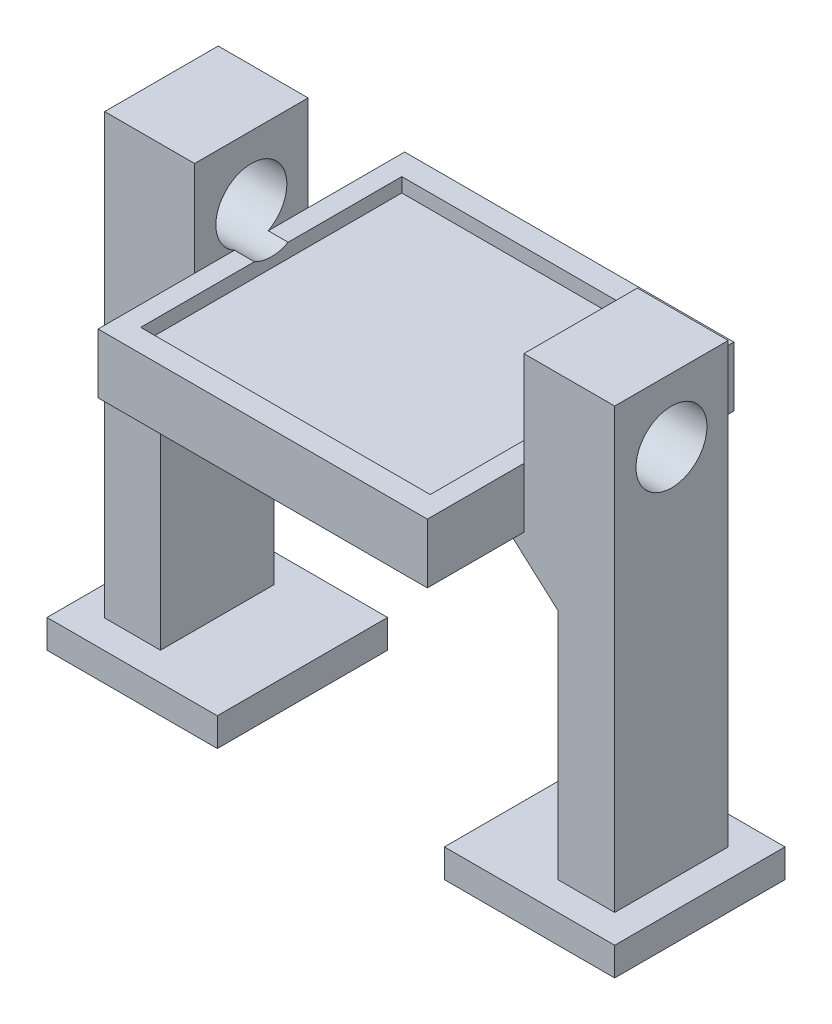
ISO-10303-21;
HEADER;
FILE_DESCRIPTION(('STEP AP214'),'2;1');
FILE_NAME('part.step','',(''),(''),'','','');
FILE_SCHEMA(('AUTOMOTIVE_DESIGN { 1 0 10303 214 1 1 1 1 }'));
ENDSEC;
DATA;
#1=APPLICATION_CONTEXT('core data for automotive mechanical design processes');
#2=APPLICATION_PROTOCOL_DEFINITION('international standard','automotive_design',2000,#1);
#3=PRODUCT_CONTEXT('',#1,'mechanical');
#4=PRODUCT('Part','Part','',(#3));
#5=PRODUCT_RELATED_PRODUCT_CATEGORY('part','',(#4));
#6=PRODUCT_DEFINITION_FORMATION('','',#4);
#7=PRODUCT_DEFINITION_CONTEXT('part definition',#1,'design');
#8=PRODUCT_DEFINITION('design','',#6,#7);
#9=PRODUCT_DEFINITION_SHAPE('','',#8);
#10=(LENGTH_UNIT() NAMED_UNIT(*) SI_UNIT(.MILLI.,.METRE.));
#11=(NAMED_UNIT(*) PLANE_ANGLE_UNIT() SI_UNIT($,.RADIAN.));
#12=(NAMED_UNIT(*) SI_UNIT($,.STERADIAN.) SOLID_ANGLE_UNIT());
#13=UNCERTAINTY_MEASURE_WITH_UNIT(LENGTH_MEASURE(1.E-05),#10,'distance_accuracy_value','');
#14=(GEOMETRIC_REPRESENTATION_CONTEXT(3) GLOBAL_UNCERTAINTY_ASSIGNED_CONTEXT((#13)) GLOBAL_UNIT_ASSIGNED_CONTEXT((#10,
#11,#12)) REPRESENTATION_CONTEXT('',''));
#15=CARTESIAN_POINT('',(0.,0.,0.));
#16=DIRECTION('',(0.,0.,1.));
#17=DIRECTION('',(1.,0.,0.));
#18=AXIS2_PLACEMENT_3D('',#15,#16,#17);
#19=CARTESIAN_POINT('',(0.,2.667,0.));
#20=DIRECTION('',(0.,1.,0.));
#21=DIRECTION('',(0.,0.,1.));
#22=AXIS2_PLACEMENT_3D('',#19,#20,#21);
#23=PLANE('',#22);
#24=DIRECTION('',(-1.,0.,0.));
#25=VECTOR('',#24,1.);
#26=CARTESIAN_POINT('',(14.3275,2.667,-0.754020722526906));
#27=LINE('',#26,#25);
#28=CARTESIAN_POINT('',(7.366,2.667,-0.754020722526906));
#29=VERTEX_POINT('',#28);
#30=CARTESIAN_POINT('',(6.477,2.667,-0.754020722526906));
#31=VERTEX_POINT('',#30);
#32=EDGE_CURVE('E50',#29,#31,#27,.T.);
#33=ORIENTED_EDGE('',*,*,#32,.F.);
#34=DIRECTION('',(0.,0.,1.));
#35=VECTOR('',#34,1.);
#36=CARTESIAN_POINT('',(7.366,2.667,-2.54));
#37=LINE('',#36,#35);
#38=CARTESIAN_POINT('',(7.366,2.667,-2.54));
#39=VERTEX_POINT('',#38);
#40=EDGE_CURVE('E43',#39,#29,#37,.T.);
#41=ORIENTED_EDGE('',*,*,#40,.F.);
#42=DIRECTION('',(0.,0.,-1.));
#43=VECTOR('',#42,1.);
#44=CARTESIAN_POINT('',(7.366,2.667,-6.858));
#45=LINE('',#44,#43);
#46=CARTESIAN_POINT('',(7.366,2.667,-6.858));
#47=VERTEX_POINT('',#46);
#48=EDGE_CURVE('E314',#39,#47,#45,.T.);
#49=ORIENTED_EDGE('',*,*,#48,.T.);
#50=DIRECTION('',(-1.,0.,0.));
#51=VECTOR('',#50,1.);
#52=CARTESIAN_POINT('',(-7.366,2.667,-6.858));
#53=LINE('',#52,#51);
#54=CARTESIAN_POINT('',(-7.366,2.667,-6.858));
#55=VERTEX_POINT('',#54);
#56=EDGE_CURVE('E318',#47,#55,#53,.T.);
#57=ORIENTED_EDGE('',*,*,#56,.T.);
#58=DIRECTION('',(0.,0.,1.));
#59=VECTOR('',#58,1.);
#60=CARTESIAN_POINT('',(-7.366,2.667,-6.858));
#61=LINE('',#60,#59);
#62=CARTESIAN_POINT('',(-7.366,2.667,-2.54));
#63=VERTEX_POINT('',#62);
#64=EDGE_CURVE('E322',#55,#63,#61,.T.);
#65=ORIENTED_EDGE('',*,*,#64,.T.);
#66=CARTESIAN_POINT('',(-7.36599999999999,2.667,-0.754020722526906));
#67=VERTEX_POINT('',#66);
#68=EDGE_CURVE('E278',#63,#67,#61,.T.);
#69=ORIENTED_EDGE('',*,*,#68,.T.);
#70=CARTESIAN_POINT('',(-6.477,2.667,-0.754020722526906));
#71=VERTEX_POINT('',#70);
#72=EDGE_CURVE('E266',#71,#67,#27,.T.);
#73=ORIENTED_EDGE('',*,*,#72,.F.);
#74=DIRECTION('',(0.,0.,1.));
#75=VECTOR('',#74,1.);
#76=CARTESIAN_POINT('',(-6.477,2.667,-5.842));
#77=LINE('',#76,#75);
#78=CARTESIAN_POINT('',(-6.477,2.667,-5.842));
#79=VERTEX_POINT('',#78);
#80=EDGE_CURVE('E275',#79,#71,#77,.T.);
#81=ORIENTED_EDGE('',*,*,#80,.F.);
#82=DIRECTION('',(-1.,0.,0.));
#83=VECTOR('',#82,1.);
#84=CARTESIAN_POINT('',(-6.477,2.667,-5.842));
#85=LINE('',#84,#83);
#86=CARTESIAN_POINT('',(6.477,2.667,-5.842));
#87=VERTEX_POINT('',#86);
#88=EDGE_CURVE('E291',#87,#79,#85,.T.);
#89=ORIENTED_EDGE('',*,*,#88,.F.);
#90=DIRECTION('',(0.,0.,-1.));
#91=VECTOR('',#90,1.);
#92=CARTESIAN_POINT('',(6.477,2.667,-5.842));
#93=LINE('',#92,#91);
#94=EDGE_CURVE('E304',#31,#87,#93,.T.);
#95=ORIENTED_EDGE('',*,*,#94,.F.);
#96=EDGE_LOOP('',(#33,#41,#49,#57,#65,#69,#73,#81,#89,#95));
#97=FACE_BOUND('',#96,.T.);
#98=ADVANCED_FACE('F35',(#97),#23,.T.);
#99=CARTESIAN_POINT('',(7.366,2.032,-6.858));
#100=DIRECTION('',(-1.,0.,0.));
#101=DIRECTION('',(0.,0.,1.));
#102=AXIS2_PLACEMENT_3D('',#99,#100,#101);
#103=PLANE('',#102);
#104=DIRECTION('',(0.,-1.,0.));
#105=VECTOR('',#104,1.);
#106=CARTESIAN_POINT('',(7.366,6.9215,-2.54));
#107=LINE('',#106,#105);
#108=CARTESIAN_POINT('',(7.366,0.,-2.54));
#109=VERTEX_POINT('',#108);
#110=EDGE_CURVE('E342',#39,#109,#107,.T.);
#111=ORIENTED_EDGE('',*,*,#110,.T.);
#112=DIRECTION('',(0.,0.,-1.));
#113=VECTOR('',#112,1.);
#114=CARTESIAN_POINT('',(7.366,0.,-6.858));
#115=LINE('',#114,#113);
#116=CARTESIAN_POINT('',(7.366,0.,-6.858));
#117=VERTEX_POINT('',#116);
#118=EDGE_CURVE('E516',#109,#117,#115,.T.);
#119=ORIENTED_EDGE('',*,*,#118,.T.);
#120=DIRECTION('',(0.,-1.,0.));
#121=VECTOR('',#120,1.);
#122=CARTESIAN_POINT('',(7.366,2.032,-6.858));
#123=LINE('',#122,#121);
#124=EDGE_CURVE('E492',#47,#117,#123,.T.);
#125=ORIENTED_EDGE('',*,*,#124,.F.);
#126=ORIENTED_EDGE('',*,*,#48,.F.);
#127=EDGE_LOOP('',(#111,#119,#125,#126));
#128=FACE_BOUND('',#127,.T.);
#129=ADVANCED_FACE('F37',(#128),#103,.F.);
#130=DIRECTION('',(0.,-1.,0.));
#131=VECTOR('',#130,1.);
#132=CARTESIAN_POINT('',(7.366,6.9215,2.54));
#133=LINE('',#132,#131);
#134=CARTESIAN_POINT('',(7.366,2.667,2.54));
#135=VERTEX_POINT('',#134);
#136=CARTESIAN_POINT('',(7.366,0.,2.54));
#137=VERTEX_POINT('',#136);
#138=EDGE_CURVE('E338',#135,#137,#133,.T.);
#139=ORIENTED_EDGE('',*,*,#138,.F.);
#140=CARTESIAN_POINT('',(7.366,2.667,6.858));
#141=VERTEX_POINT('',#140);
#142=EDGE_CURVE('E315',#141,#135,#45,.T.);
#143=ORIENTED_EDGE('',*,*,#142,.F.);
#144=DIRECTION('',(0.,-1.,0.));
#145=VECTOR('',#144,1.);
#146=CARTESIAN_POINT('',(7.366,2.032,6.858));
#147=LINE('',#146,#145);
#148=CARTESIAN_POINT('',(7.366,0.,6.858));
#149=VERTEX_POINT('',#148);
#150=EDGE_CURVE('E502',#141,#149,#147,.T.);
#151=ORIENTED_EDGE('',*,*,#150,.T.);
#152=EDGE_CURVE('E513',#149,#137,#115,.T.);
#153=ORIENTED_EDGE('',*,*,#152,.T.);
#154=EDGE_LOOP('',(#139,#143,#151,#153));
#155=FACE_BOUND('',#154,.T.);
#156=ADVANCED_FACE('F582',(#155),#103,.F.);
#157=CARTESIAN_POINT('',(-7.366,2.032,-6.858));
#158=DIRECTION('',(1.,0.,0.));
#159=DIRECTION('',(0.,0.,-1.));
#160=AXIS2_PLACEMENT_3D('',#157,#158,#159);
#161=PLANE('',#160);
#162=DIRECTION('',(0.,-1.,0.));
#163=VECTOR('',#162,1.);
#164=CARTESIAN_POINT('',(-7.366,6.9215,2.54));
#165=LINE('',#164,#163);
#166=CARTESIAN_POINT('',(-7.366,2.667,2.54));
#167=VERTEX_POINT('',#166);
#168=CARTESIAN_POINT('',(-7.366,0.,2.54));
#169=VERTEX_POINT('',#168);
#170=EDGE_CURVE('E360',#167,#169,#165,.T.);
#171=ORIENTED_EDGE('',*,*,#170,.T.);
#172=DIRECTION('',(0.,0.,1.));
#173=VECTOR('',#172,1.);
#174=CARTESIAN_POINT('',(-7.366,0.,-6.858));
#175=LINE('',#174,#173);
#176=CARTESIAN_POINT('',(-7.366,0.,6.858));
#177=VERTEX_POINT('',#176);
#178=EDGE_CURVE('E510',#169,#177,#175,.T.);
#179=ORIENTED_EDGE('',*,*,#178,.T.);
#180=DIRECTION('',(0.,-1.,0.));
#181=VECTOR('',#180,1.);
#182=CARTESIAN_POINT('',(-7.366,2.032,6.858));
#183=LINE('',#182,#181);
#184=CARTESIAN_POINT('',(-7.366,2.667,6.858));
#185=VERTEX_POINT('',#184);
#186=EDGE_CURVE('E499',#185,#177,#183,.T.);
#187=ORIENTED_EDGE('',*,*,#186,.F.);
#188=EDGE_CURVE('E321',#167,#185,#61,.T.);
#189=ORIENTED_EDGE('',*,*,#188,.F.);
#190=EDGE_LOOP('',(#171,#179,#187,#189));
#191=FACE_BOUND('',#190,.T.);
#192=ADVANCED_FACE('F734',(#191),#161,.F.);
#193=DIRECTION('',(0.,-1.,0.));
#194=VECTOR('',#193,1.);
#195=CARTESIAN_POINT('',(-7.366,6.9215,-2.54));
#196=LINE('',#195,#194);
#197=CARTESIAN_POINT('',(-7.366,0.,-2.54));
#198=VERTEX_POINT('',#197);
#199=EDGE_CURVE('E356',#63,#198,#196,.T.);
#200=ORIENTED_EDGE('',*,*,#199,.F.);
#201=ORIENTED_EDGE('',*,*,#64,.F.);
#202=DIRECTION('',(0.,-1.,0.));
#203=VECTOR('',#202,1.);
#204=CARTESIAN_POINT('',(-7.366,2.032,-6.858));
#205=LINE('',#204,#203);
#206=CARTESIAN_POINT('',(-7.366,0.,-6.858));
#207=VERTEX_POINT('',#206);
#208=EDGE_CURVE('E496',#55,#207,#205,.T.);
#209=ORIENTED_EDGE('',*,*,#208,.T.);
#210=EDGE_CURVE('E507',#207,#198,#175,.T.);
#211=ORIENTED_EDGE('',*,*,#210,.T.);
#212=EDGE_LOOP('',(#200,#201,#209,#211));
#213=FACE_BOUND('',#212,.T.);
#214=ADVANCED_FACE('F536',(#213),#161,.F.);
#215=CARTESIAN_POINT('',(12.7,-12.7,-2.54));
#216=DIRECTION('',(0.,0.,1.));
#217=DIRECTION('',(1.,0.,0.));
#218=AXIS2_PLACEMENT_3D('',#215,#216,#217);
#219=PLANE('',#218);
#220=DIRECTION('',(1.,0.,0.));
#221=VECTOR('',#220,1.);
#222=CARTESIAN_POINT('',(12.7,-12.7,-2.54));
#223=LINE('',#222,#221);
#224=CARTESIAN_POINT('',(-11.39,-12.7,-2.54));
#225=VERTEX_POINT('',#224);
#226=CARTESIAN_POINT('',(-8.89,-12.7,-2.54));
#227=VERTEX_POINT('',#226);
#228=EDGE_CURVE('E469',#225,#227,#223,.T.);
#229=ORIENTED_EDGE('',*,*,#228,.F.);
#230=DIRECTION('',(0.,-1.,0.));
#231=VECTOR('',#230,1.);
#232=CARTESIAN_POINT('',(-11.39,0.,-2.54));
#233=LINE('',#232,#231);
#234=CARTESIAN_POINT('',(-11.39,6.9215,-2.54));
#235=VERTEX_POINT('',#234);
#236=EDGE_CURVE('E364',#235,#225,#233,.T.);
#237=ORIENTED_EDGE('',*,*,#236,.F.);
#238=DIRECTION('',(-1.,0.,0.));
#239=VECTOR('',#238,1.);
#240=CARTESIAN_POINT('',(-11.39,6.9215,-2.54));
#241=LINE('',#240,#239);
#242=CARTESIAN_POINT('',(-7.366,6.9215,-2.54));
#243=VERTEX_POINT('',#242);
#244=EDGE_CURVE('E353',#243,#235,#241,.T.);
#245=ORIENTED_EDGE('',*,*,#244,.F.);
#246=EDGE_CURVE('E357',#243,#63,#196,.T.);
#247=ORIENTED_EDGE('',*,*,#246,.T.);
#248=ORIENTED_EDGE('',*,*,#199,.T.);
#249=DIRECTION('',(1.,0.,0.));
#250=VECTOR('',#249,1.);
#251=CARTESIAN_POINT('',(12.7,0.,-2.54));
#252=LINE('',#251,#250);
#253=CARTESIAN_POINT('',(-6.16600000000001,0.,-2.54));
#254=VERTEX_POINT('',#253);
#255=EDGE_CURVE('E519',#198,#254,#252,.T.);
#256=ORIENTED_EDGE('',*,*,#255,.T.);
#257=DIRECTION('',(0.768221279597375,0.640184399664481,0.));
#258=VECTOR('',#257,1.);
#259=CARTESIAN_POINT('',(-2.52704918032788,3.03245901639345,-2.54));
#260=LINE('',#259,#258);
#261=CARTESIAN_POINT('',(-8.89,-2.27,-2.54));
#262=VERTEX_POINT('',#261);
#263=EDGE_CURVE('E375',#262,#254,#260,.T.);
#264=ORIENTED_EDGE('',*,*,#263,.F.);
#265=DIRECTION('',(0.,-1.,0.));
#266=VECTOR('',#265,1.);
#267=CARTESIAN_POINT('',(-8.89,0.,-2.54));
#268=LINE('',#267,#266);
#269=EDGE_CURVE('E372',#262,#227,#268,.T.);
#270=ORIENTED_EDGE('',*,*,#269,.T.);
#271=EDGE_LOOP('',(#229,#237,#245,#247,#248,#256,#264,#270));
#272=FACE_BOUND('',#271,.T.);
#273=ADVANCED_FACE('F529',(#272),#219,.F.);
#274=CARTESIAN_POINT('',(12.7,-12.7,2.54));
#275=DIRECTION('',(0.,0.,-1.));
#276=DIRECTION('',(-1.,0.,0.));
#277=AXIS2_PLACEMENT_3D('',#274,#275,#276);
#278=PLANE('',#277);
#279=DIRECTION('',(-1.,0.,0.));
#280=VECTOR('',#279,1.);
#281=CARTESIAN_POINT('',(12.7,0.,2.54));
#282=LINE('',#281,#280);
#283=CARTESIAN_POINT('',(-6.16600000000001,0.,2.54));
#284=VERTEX_POINT('',#283);
#285=EDGE_CURVE('E517',#284,#169,#282,.T.);
#286=ORIENTED_EDGE('',*,*,#285,.T.);
#287=ORIENTED_EDGE('',*,*,#170,.F.);
#288=CARTESIAN_POINT('',(-7.366,6.9215,2.54));
#289=VERTEX_POINT('',#288);
#290=EDGE_CURVE('E361',#289,#167,#165,.T.);
#291=ORIENTED_EDGE('',*,*,#290,.F.);
#292=DIRECTION('',(1.,0.,0.));
#293=VECTOR('',#292,1.);
#294=CARTESIAN_POINT('',(-7.366,6.9215,2.54));
#295=LINE('',#294,#293);
#296=CARTESIAN_POINT('',(-11.39,6.9215,2.54));
#297=VERTEX_POINT('',#296);
#298=EDGE_CURVE('E349',#297,#289,#295,.T.);
#299=ORIENTED_EDGE('',*,*,#298,.F.);
#300=DIRECTION('',(0.,-1.,0.));
#301=VECTOR('',#300,1.);
#302=CARTESIAN_POINT('',(-11.39,-12.7,2.54));
#303=LINE('',#302,#301);
#304=CARTESIAN_POINT('',(-11.39,-12.7,2.54));
#305=VERTEX_POINT('',#304);
#306=EDGE_CURVE('E369',#297,#305,#303,.T.);
#307=ORIENTED_EDGE('',*,*,#306,.T.);
#308=DIRECTION('',(-1.,0.,0.));
#309=VECTOR('',#308,1.);
#310=CARTESIAN_POINT('',(12.7,-12.7,2.54));
#311=LINE('',#310,#309);
#312=CARTESIAN_POINT('',(-8.89,-12.7,2.54));
#313=VERTEX_POINT('',#312);
#314=EDGE_CURVE('E472',#313,#305,#311,.T.);
#315=ORIENTED_EDGE('',*,*,#314,.F.);
#316=DIRECTION('',(0.,-1.,0.));
#317=VECTOR('',#316,1.);
#318=CARTESIAN_POINT('',(-8.89,-12.7,2.54));
#319=LINE('',#318,#317);
#320=CARTESIAN_POINT('',(-8.89,-2.27,2.54));
#321=VERTEX_POINT('',#320);
#322=EDGE_CURVE('E388',#321,#313,#319,.T.);
#323=ORIENTED_EDGE('',*,*,#322,.F.);
#324=DIRECTION('',(0.768221279597375,0.640184399664481,0.));
#325=VECTOR('',#324,1.);
#326=CARTESIAN_POINT('',(-1.27786885245904,4.07344262295081,2.54));
#327=LINE('',#326,#325);
#328=EDGE_CURVE('E402',#321,#284,#327,.T.);
#329=ORIENTED_EDGE('',*,*,#328,.T.);
#330=EDGE_LOOP('',(#286,#287,#291,#299,#307,#315,#323,#329));
#331=FACE_BOUND('',#330,.T.);
#332=ADVANCED_FACE('F555',(#331),#278,.F.);
#333=CARTESIAN_POINT('',(8.89,-12.7,-2.54));
#334=VERTEX_POINT('',#333);
#335=CARTESIAN_POINT('',(11.43,-12.7,-2.54));
#336=VERTEX_POINT('',#335);
#337=EDGE_CURVE('E473',#334,#336,#223,.T.);
#338=ORIENTED_EDGE('',*,*,#337,.F.);
#339=DIRECTION('',(0.,-1.,0.));
#340=VECTOR('',#339,1.);
#341=CARTESIAN_POINT('',(8.89,0.,-2.54));
#342=LINE('',#341,#340);
#343=CARTESIAN_POINT('',(8.89,-2.27,-2.54));
#344=VERTEX_POINT('',#343);
#345=EDGE_CURVE('E381',#344,#334,#342,.T.);
#346=ORIENTED_EDGE('',*,*,#345,.F.);
#347=DIRECTION('',(-0.7456250672553,0.666365709712414,0.));
#348=VECTOR('',#347,1.);
#349=CARTESIAN_POINT('',(2.81967469516136,3.155054504718,-2.54));
#350=LINE('',#349,#348);
#351=CARTESIAN_POINT('',(6.35,0.,-2.54));
#352=VERTEX_POINT('',#351);
#353=EDGE_CURVE('E378',#344,#352,#350,.T.);
#354=ORIENTED_EDGE('',*,*,#353,.T.);
#355=EDGE_CURVE('E495',#352,#109,#252,.T.);
#356=ORIENTED_EDGE('',*,*,#355,.T.);
#357=ORIENTED_EDGE('',*,*,#110,.F.);
#358=CARTESIAN_POINT('',(7.366,6.9215,-2.54));
#359=VERTEX_POINT('',#358);
#360=EDGE_CURVE('E343',#359,#39,#107,.T.);
#361=ORIENTED_EDGE('',*,*,#360,.F.);
#362=DIRECTION('',(-1.,0.,0.));
#363=VECTOR('',#362,1.);
#364=CARTESIAN_POINT('',(11.43,6.9215,-2.54));
#365=LINE('',#364,#363);
#366=CARTESIAN_POINT('',(11.43,6.9215,-2.54));
#367=VERTEX_POINT('',#366);
#368=EDGE_CURVE('E331',#367,#359,#365,.T.);
#369=ORIENTED_EDGE('',*,*,#368,.F.);
#370=DIRECTION('',(0.,-1.,0.));
#371=VECTOR('',#370,1.);
#372=CARTESIAN_POINT('',(11.43,0.,-2.54));
#373=LINE('',#372,#371);
#374=EDGE_CURVE('E407',#367,#336,#373,.T.);
#375=ORIENTED_EDGE('',*,*,#374,.T.);
#376=EDGE_LOOP('',(#338,#346,#354,#356,#357,#361,#369,#375));
#377=FACE_BOUND('',#376,.T.);
#378=ADVANCED_FACE('F909',(#377),#219,.F.);
#379=DIRECTION('',(-0.7456250672553,0.666365709712414,0.));
#380=VECTOR('',#379,1.);
#381=CARTESIAN_POINT('',(16.1904343142746,-8.79440389504071,2.54));
#382=LINE('',#381,#380);
#383=CARTESIAN_POINT('',(8.89,-2.27,2.54));
#384=VERTEX_POINT('',#383);
#385=CARTESIAN_POINT('',(6.35,0.,2.54));
#386=VERTEX_POINT('',#385);
#387=EDGE_CURVE('E405',#384,#386,#382,.T.);
#388=ORIENTED_EDGE('',*,*,#387,.F.);
#389=DIRECTION('',(0.,-1.,0.));
#390=VECTOR('',#389,1.);
#391=CARTESIAN_POINT('',(8.89,-12.7,2.54));
#392=LINE('',#391,#390);
#393=CARTESIAN_POINT('',(8.89,-12.7,2.54));
#394=VERTEX_POINT('',#393);
#395=EDGE_CURVE('E399',#384,#394,#392,.T.);
#396=ORIENTED_EDGE('',*,*,#395,.T.);
#397=CARTESIAN_POINT('',(11.43,-12.7,2.54));
#398=VERTEX_POINT('',#397);
#399=EDGE_CURVE('E478',#398,#394,#311,.T.);
#400=ORIENTED_EDGE('',*,*,#399,.F.);
#401=DIRECTION('',(0.,-1.,0.));
#402=VECTOR('',#401,1.);
#403=CARTESIAN_POINT('',(11.43,-12.7,2.54));
#404=LINE('',#403,#402);
#405=CARTESIAN_POINT('',(11.43,6.9215,2.54));
#406=VERTEX_POINT('',#405);
#407=EDGE_CURVE('E413',#406,#398,#404,.T.);
#408=ORIENTED_EDGE('',*,*,#407,.F.);
#409=DIRECTION('',(1.,0.,0.));
#410=VECTOR('',#409,1.);
#411=CARTESIAN_POINT('',(7.366,6.9215,2.54));
#412=LINE('',#411,#410);
#413=CARTESIAN_POINT('',(7.366,6.9215,2.54));
#414=VERTEX_POINT('',#413);
#415=EDGE_CURVE('E335',#414,#406,#412,.T.);
#416=ORIENTED_EDGE('',*,*,#415,.F.);
#417=EDGE_CURVE('E339',#414,#135,#133,.T.);
#418=ORIENTED_EDGE('',*,*,#417,.T.);
#419=ORIENTED_EDGE('',*,*,#138,.T.);
#420=EDGE_CURVE('E458',#137,#386,#282,.T.);
#421=ORIENTED_EDGE('',*,*,#420,.T.);
#422=EDGE_LOOP('',(#388,#396,#400,#408,#416,#418,#419,#421));
#423=FACE_BOUND('',#422,.T.);
#424=ADVANCED_FACE('F589',(#423),#278,.F.);
#425=CARTESIAN_POINT('',(0.,0.,0.));
#426=DIRECTION('',(0.,1.,0.));
#427=DIRECTION('',(0.,0.,1.));
#428=AXIS2_PLACEMENT_3D('',#425,#426,#427);
#429=PLANE('',#428);
#430=ORIENTED_EDGE('',*,*,#255,.F.);
#431=ORIENTED_EDGE('',*,*,#210,.F.);
#432=DIRECTION('',(-1.,0.,0.));
#433=VECTOR('',#432,1.);
#434=CARTESIAN_POINT('',(-7.366,0.,-6.858));
#435=LINE('',#434,#433);
#436=EDGE_CURVE('E511',#117,#207,#435,.T.);
#437=ORIENTED_EDGE('',*,*,#436,.F.);
#438=ORIENTED_EDGE('',*,*,#118,.F.);
#439=ORIENTED_EDGE('',*,*,#355,.F.);
#440=DIRECTION('',(0.,0.,-1.));
#441=VECTOR('',#440,1.);
#442=CARTESIAN_POINT('',(6.35,0.,7.46));
#443=LINE('',#442,#441);
#444=EDGE_CURVE('E393',#386,#352,#443,.T.);
#445=ORIENTED_EDGE('',*,*,#444,.F.);
#446=ORIENTED_EDGE('',*,*,#420,.F.);
#447=ORIENTED_EDGE('',*,*,#152,.F.);
#448=DIRECTION('',(1.,0.,0.));
#449=VECTOR('',#448,1.);
#450=CARTESIAN_POINT('',(-7.366,0.,6.858));
#451=LINE('',#450,#449);
#452=EDGE_CURVE('E505',#177,#149,#451,.T.);
#453=ORIENTED_EDGE('',*,*,#452,.F.);
#454=ORIENTED_EDGE('',*,*,#178,.F.);
#455=ORIENTED_EDGE('',*,*,#285,.F.);
#456=DIRECTION('',(0.,0.,-1.));
#457=VECTOR('',#456,1.);
#458=CARTESIAN_POINT('',(-6.16600000000001,0.,7.46));
#459=LINE('',#458,#457);
#460=EDGE_CURVE('E395',#284,#254,#459,.T.);
#461=ORIENTED_EDGE('',*,*,#460,.T.);
#462=EDGE_LOOP('',(#430,#431,#437,#438,#439,#445,#446,#447,#453,#454,#455,#461));
#463=FACE_BOUND('',#462,.T.);
#464=ADVANCED_FACE('F532',(#463),#429,.F.);
#465=CARTESIAN_POINT('',(-7.366,2.032,-6.858));
#466=DIRECTION('',(0.,0.,1.));
#467=DIRECTION('',(1.,0.,0.));
#468=AXIS2_PLACEMENT_3D('',#465,#466,#467);
#469=PLANE('',#468);
#470=ORIENTED_EDGE('',*,*,#436,.T.);
#471=ORIENTED_EDGE('',*,*,#208,.F.);
#472=ORIENTED_EDGE('',*,*,#56,.F.);
#473=ORIENTED_EDGE('',*,*,#124,.T.);
#474=EDGE_LOOP('',(#470,#471,#472,#473));
#475=FACE_BOUND('',#474,.T.);
#476=ADVANCED_FACE('F540',(#475),#469,.F.);
#477=CARTESIAN_POINT('',(-7.366,2.032,6.858));
#478=DIRECTION('',(0.,0.,-1.));
#479=DIRECTION('',(-1.,0.,0.));
#480=AXIS2_PLACEMENT_3D('',#477,#478,#479);
#481=PLANE('',#480);
#482=ORIENTED_EDGE('',*,*,#452,.T.);
#483=ORIENTED_EDGE('',*,*,#150,.F.);
#484=DIRECTION('',(1.,0.,0.));
#485=VECTOR('',#484,1.);
#486=CARTESIAN_POINT('',(-7.366,2.667,6.858));
#487=LINE('',#486,#485);
#488=EDGE_CURVE('E324',#185,#141,#487,.T.);
#489=ORIENTED_EDGE('',*,*,#488,.F.);
#490=ORIENTED_EDGE('',*,*,#186,.T.);
#491=EDGE_LOOP('',(#482,#483,#489,#490));
#492=FACE_BOUND('',#491,.T.);
#493=ADVANCED_FACE('F578',(#492),#481,.F.);
#494=CARTESIAN_POINT('',(-12.7,-12.7,-2.54));
#495=DIRECTION('',(1.,0.,0.));
#496=DIRECTION('',(0.,0.,-1.));
#497=AXIS2_PLACEMENT_3D('',#494,#495,#496);
#498=PLANE('',#497);
#499=DIRECTION('',(0.,0.,-1.));
#500=VECTOR('',#499,1.);
#501=CARTESIAN_POINT('',(-12.7,-12.7,3.81));
#502=LINE('',#501,#500);
#503=CARTESIAN_POINT('',(-12.7,-12.7,3.81));
#504=VERTEX_POINT('',#503);
#505=CARTESIAN_POINT('',(-12.7,-12.7,-3.81));
#506=VERTEX_POINT('',#505);
#507=EDGE_CURVE('E428',#504,#506,#502,.T.);
#508=ORIENTED_EDGE('',*,*,#507,.T.);
#509=DIRECTION('',(0.,1.,0.));
#510=VECTOR('',#509,1.);
#511=CARTESIAN_POINT('',(-12.7,-13.97,-3.81));
#512=LINE('',#511,#510);
#513=CARTESIAN_POINT('',(-12.7,-13.97,-3.81));
#514=VERTEX_POINT('',#513);
#515=EDGE_CURVE('E434',#514,#506,#512,.T.);
#516=ORIENTED_EDGE('',*,*,#515,.F.);
#517=DIRECTION('',(0.,0.,-1.));
#518=VECTOR('',#517,1.);
#519=CARTESIAN_POINT('',(-12.7,-13.97,3.81));
#520=LINE('',#519,#518);
#521=CARTESIAN_POINT('',(-12.7,-13.97,3.81));
#522=VERTEX_POINT('',#521);
#523=EDGE_CURVE('E422',#522,#514,#520,.T.);
#524=ORIENTED_EDGE('',*,*,#523,.F.);
#525=DIRECTION('',(0.,1.,0.));
#526=VECTOR('',#525,1.);
#527=CARTESIAN_POINT('',(-12.7,-13.97,3.81));
#528=LINE('',#527,#526);
#529=EDGE_CURVE('E437',#522,#504,#528,.T.);
#530=ORIENTED_EDGE('',*,*,#529,.T.);
#531=EDGE_LOOP('',(#508,#516,#524,#530));
#532=FACE_BOUND('',#531,.T.);
#533=ADVANCED_FACE('F728',(#532),#498,.F.);
#534=CARTESIAN_POINT('',(12.7,-12.7,-2.54));
#535=DIRECTION('',(-1.,0.,0.));
#536=DIRECTION('',(0.,0.,1.));
#537=AXIS2_PLACEMENT_3D('',#534,#535,#536);
#538=PLANE('',#537);
#539=DIRECTION('',(0.,0.,1.));
#540=VECTOR('',#539,1.);
#541=CARTESIAN_POINT('',(12.7,-12.7,-3.81));
#542=LINE('',#541,#540);
#543=CARTESIAN_POINT('',(12.7,-12.7,-3.81));
#544=VERTEX_POINT('',#543);
#545=CARTESIAN_POINT('',(12.7,-12.7,3.81));
#546=VERTEX_POINT('',#545);
#547=EDGE_CURVE('E460',#544,#546,#542,.T.);
#548=ORIENTED_EDGE('',*,*,#547,.T.);
#549=DIRECTION('',(0.,1.,0.));
#550=VECTOR('',#549,1.);
#551=CARTESIAN_POINT('',(12.7,-13.97,3.81));
#552=LINE('',#551,#550);
#553=CARTESIAN_POINT('',(12.7,-13.97,3.81));
#554=VERTEX_POINT('',#553);
#555=EDGE_CURVE('E1114',#554,#546,#552,.T.);
#556=ORIENTED_EDGE('',*,*,#555,.F.);
#557=DIRECTION('',(0.,0.,1.));
#558=VECTOR('',#557,1.);
#559=CARTESIAN_POINT('',(12.7,-13.97,-3.81));
#560=LINE('',#559,#558);
#561=CARTESIAN_POINT('',(12.7,-13.97,-3.81));
#562=VERTEX_POINT('',#561);
#563=EDGE_CURVE('E450',#562,#554,#560,.T.);
#564=ORIENTED_EDGE('',*,*,#563,.F.);
#565=DIRECTION('',(0.,1.,0.));
#566=VECTOR('',#565,1.);
#567=CARTESIAN_POINT('',(12.7,-13.97,-3.81));
#568=LINE('',#567,#566);
#569=EDGE_CURVE('E1112',#562,#544,#568,.T.);
#570=ORIENTED_EDGE('',*,*,#569,.T.);
#571=EDGE_LOOP('',(#548,#556,#564,#570));
#572=FACE_BOUND('',#571,.T.);
#573=ADVANCED_FACE('F755',(#572),#538,.F.);
#574=CARTESIAN_POINT('',(0.,-12.7,0.));
#575=DIRECTION('',(0.,-1.,0.));
#576=DIRECTION('',(0.,0.,-1.));
#577=AXIS2_PLACEMENT_3D('',#574,#575,#576);
#578=PLANE('',#577);
#579=DIRECTION('',(0.,0.,-1.));
#580=VECTOR('',#579,1.);
#581=CARTESIAN_POINT('',(5.08,-12.7,-3.81));
#582=LINE('',#581,#580);
#583=CARTESIAN_POINT('',(5.08,-12.7,3.81));
#584=VERTEX_POINT('',#583);
#585=CARTESIAN_POINT('',(5.08,-12.7,-3.81));
#586=VERTEX_POINT('',#585);
#587=EDGE_CURVE('E455',#584,#586,#582,.T.);
#588=ORIENTED_EDGE('',*,*,#587,.F.);
#589=DIRECTION('',(-1.,0.,0.));
#590=VECTOR('',#589,1.);
#591=CARTESIAN_POINT('',(12.7,-12.7,3.81));
#592=LINE('',#591,#590);
#593=EDGE_CURVE('E448',#546,#584,#592,.T.);
#594=ORIENTED_EDGE('',*,*,#593,.F.);
#595=ORIENTED_EDGE('',*,*,#547,.F.);
#596=DIRECTION('',(1.,0.,0.));
#597=VECTOR('',#596,1.);
#598=CARTESIAN_POINT('',(12.7,-12.7,-3.81));
#599=LINE('',#598,#597);
#600=EDGE_CURVE('E443',#586,#544,#599,.T.);
#601=ORIENTED_EDGE('',*,*,#600,.F.);
#602=EDGE_LOOP('',(#588,#594,#595,#601));
#603=FACE_BOUND('',#602,.T.);
#604=ORIENTED_EDGE('',*,*,#399,.T.);
#605=DIRECTION('',(0.,0.,-1.));
#606=VECTOR('',#605,1.);
#607=CARTESIAN_POINT('',(8.89,-12.7,7.46));
#608=LINE('',#607,#606);
#609=EDGE_CURVE('E389',#394,#334,#608,.T.);
#610=ORIENTED_EDGE('',*,*,#609,.T.);
#611=ORIENTED_EDGE('',*,*,#337,.T.);
#612=DIRECTION('',(0.,0.,-1.));
#613=VECTOR('',#612,1.);
#614=CARTESIAN_POINT('',(11.43,-12.7,7.46));
#615=LINE('',#614,#613);
#616=EDGE_CURVE('E410',#398,#336,#615,.T.);
#617=ORIENTED_EDGE('',*,*,#616,.F.);
#618=EDGE_LOOP('',(#604,#610,#611,#617));
#619=FACE_BOUND('',#618,.T.);
#620=ADVANCED_FACE('F763',(#603,#619),#578,.F.);
#621=CARTESIAN_POINT('',(5.08,-13.97,-3.81));
#622=DIRECTION('',(1.,0.,0.));
#623=DIRECTION('',(0.,0.,-1.));
#624=AXIS2_PLACEMENT_3D('',#621,#622,#623);
#625=PLANE('',#624);
#626=DIRECTION('',(0.,1.,0.));
#627=VECTOR('',#626,1.);
#628=CARTESIAN_POINT('',(5.08,-13.97,3.81));
#629=LINE('',#628,#627);
#630=CARTESIAN_POINT('',(5.08,-13.97,3.81));
#631=VERTEX_POINT('',#630);
#632=EDGE_CURVE('E454',#631,#584,#629,.T.);
#633=ORIENTED_EDGE('',*,*,#632,.T.);
#634=ORIENTED_EDGE('',*,*,#587,.T.);
#635=DIRECTION('',(0.,1.,0.));
#636=VECTOR('',#635,1.);
#637=CARTESIAN_POINT('',(5.08,-13.97,-3.81));
#638=LINE('',#637,#636);
#639=CARTESIAN_POINT('',(5.08,-13.97,-3.81));
#640=VERTEX_POINT('',#639);
#641=EDGE_CURVE('E467',#640,#586,#638,.T.);
#642=ORIENTED_EDGE('',*,*,#641,.F.);
#643=DIRECTION('',(0.,0.,-1.));
#644=VECTOR('',#643,1.);
#645=CARTESIAN_POINT('',(5.08,-13.97,-3.81));
#646=LINE('',#645,#644);
#647=EDGE_CURVE('E444',#631,#640,#646,.T.);
#648=ORIENTED_EDGE('',*,*,#647,.F.);
#649=EDGE_LOOP('',(#633,#634,#642,#648));
#650=FACE_BOUND('',#649,.T.);
#651=ADVANCED_FACE('F771',(#650),#625,.F.);
#652=CARTESIAN_POINT('',(12.7,-13.97,-3.81));
#653=DIRECTION('',(0.,0.,1.));
#654=DIRECTION('',(1.,0.,0.));
#655=AXIS2_PLACEMENT_3D('',#652,#653,#654);
#656=PLANE('',#655);
#657=ORIENTED_EDGE('',*,*,#600,.T.);
#658=ORIENTED_EDGE('',*,*,#569,.F.);
#659=DIRECTION('',(1.,0.,0.));
#660=VECTOR('',#659,1.);
#661=CARTESIAN_POINT('',(12.7,-13.97,-3.81));
#662=LINE('',#661,#660);
#663=EDGE_CURVE('E447',#640,#562,#662,.T.);
#664=ORIENTED_EDGE('',*,*,#663,.F.);
#665=ORIENTED_EDGE('',*,*,#641,.T.);
#666=EDGE_LOOP('',(#657,#658,#664,#665));
#667=FACE_BOUND('',#666,.T.);
#668=ADVANCED_FACE('F779',(#667),#656,.F.);
#669=CARTESIAN_POINT('',(12.7,-13.97,3.81));
#670=DIRECTION('',(0.,0.,-1.));
#671=DIRECTION('',(-1.,0.,0.));
#672=AXIS2_PLACEMENT_3D('',#669,#670,#671);
#673=PLANE('',#672);
#674=ORIENTED_EDGE('',*,*,#593,.T.);
#675=ORIENTED_EDGE('',*,*,#632,.F.);
#676=DIRECTION('',(-1.,0.,0.));
#677=VECTOR('',#676,1.);
#678=CARTESIAN_POINT('',(12.7,-13.97,3.81));
#679=LINE('',#678,#677);
#680=EDGE_CURVE('E452',#554,#631,#679,.T.);
#681=ORIENTED_EDGE('',*,*,#680,.F.);
#682=ORIENTED_EDGE('',*,*,#555,.T.);
#683=EDGE_LOOP('',(#674,#675,#681,#682));
#684=FACE_BOUND('',#683,.T.);
#685=ADVANCED_FACE('F788',(#684),#673,.F.);
#686=CARTESIAN_POINT('',(0.,-13.97,0.));
#687=DIRECTION('',(0.,-1.,0.));
#688=DIRECTION('',(0.,0.,-1.));
#689=AXIS2_PLACEMENT_3D('',#686,#687,#688);
#690=PLANE('',#689);
#691=ORIENTED_EDGE('',*,*,#647,.T.);
#692=ORIENTED_EDGE('',*,*,#663,.T.);
#693=ORIENTED_EDGE('',*,*,#563,.T.);
#694=ORIENTED_EDGE('',*,*,#680,.T.);
#695=EDGE_LOOP('',(#691,#692,#693,#694));
#696=FACE_BOUND('',#695,.T.);
#697=ADVANCED_FACE('F796',(#696),#690,.T.);
#698=CARTESIAN_POINT('',(0.,-12.7,0.));
#699=DIRECTION('',(0.,-1.,0.));
#700=DIRECTION('',(0.,0.,-1.));
#701=AXIS2_PLACEMENT_3D('',#698,#699,#700);
#702=PLANE('',#701);
#703=DIRECTION('',(1.,0.,0.));
#704=VECTOR('',#703,1.);
#705=CARTESIAN_POINT('',(-12.7,-12.7,-3.81));
#706=LINE('',#705,#704);
#707=CARTESIAN_POINT('',(-5.08,-12.7,-3.81));
#708=VERTEX_POINT('',#707);
#709=EDGE_CURVE('E420',#506,#708,#706,.T.);
#710=ORIENTED_EDGE('',*,*,#709,.F.);
#711=ORIENTED_EDGE('',*,*,#507,.F.);
#712=DIRECTION('',(-1.,0.,0.));
#713=VECTOR('',#712,1.);
#714=CARTESIAN_POINT('',(-12.7,-12.7,3.81));
#715=LINE('',#714,#713);
#716=CARTESIAN_POINT('',(-5.08,-12.7,3.81));
#717=VERTEX_POINT('',#716);
#718=EDGE_CURVE('E415',#717,#504,#715,.T.);
#719=ORIENTED_EDGE('',*,*,#718,.F.);
#720=DIRECTION('',(0.,0.,-1.));
#721=VECTOR('',#720,1.);
#722=CARTESIAN_POINT('',(-5.08,-12.7,0.));
#723=LINE('',#722,#721);
#724=EDGE_CURVE('E457',#717,#708,#723,.T.);
#725=ORIENTED_EDGE('',*,*,#724,.T.);
#726=EDGE_LOOP('',(#710,#711,#719,#725));
#727=FACE_BOUND('',#726,.T.);
#728=ORIENTED_EDGE('',*,*,#314,.T.);
#729=DIRECTION('',(0.,0.,-1.));
#730=VECTOR('',#729,1.);
#731=CARTESIAN_POINT('',(-11.39,-12.7,7.46));
#732=LINE('',#731,#730);
#733=EDGE_CURVE('E366',#305,#225,#732,.T.);
#734=ORIENTED_EDGE('',*,*,#733,.T.);
#735=ORIENTED_EDGE('',*,*,#228,.T.);
#736=DIRECTION('',(0.,0.,-1.));
#737=VECTOR('',#736,1.);
#738=CARTESIAN_POINT('',(-8.89,-12.7,7.46));
#739=LINE('',#738,#737);
#740=EDGE_CURVE('E385',#313,#227,#739,.T.);
#741=ORIENTED_EDGE('',*,*,#740,.F.);
#742=EDGE_LOOP('',(#728,#734,#735,#741));
#743=FACE_BOUND('',#742,.T.);
#744=ADVANCED_FACE('F552',(#727,#743),#702,.F.);
#745=CARTESIAN_POINT('',(-5.08,-13.97,3.81));
#746=DIRECTION('',(-1.,0.,0.));
#747=DIRECTION('',(0.,0.,1.));
#748=AXIS2_PLACEMENT_3D('',#745,#746,#747);
#749=PLANE('',#748);
#750=DIRECTION('',(0.,1.,0.));
#751=VECTOR('',#750,1.);
#752=CARTESIAN_POINT('',(-5.08,-13.97,-3.81));
#753=LINE('',#752,#751);
#754=CARTESIAN_POINT('',(-5.08,-13.97,-3.81));
#755=VERTEX_POINT('',#754);
#756=EDGE_CURVE('E426',#755,#708,#753,.T.);
#757=ORIENTED_EDGE('',*,*,#756,.T.);
#758=ORIENTED_EDGE('',*,*,#724,.F.);
#759=DIRECTION('',(0.,1.,0.));
#760=VECTOR('',#759,1.);
#761=CARTESIAN_POINT('',(-5.08,-13.97,3.81));
#762=LINE('',#761,#760);
#763=CARTESIAN_POINT('',(-5.08,-13.97,3.81));
#764=VERTEX_POINT('',#763);
#765=EDGE_CURVE('E440',#764,#717,#762,.T.);
#766=ORIENTED_EDGE('',*,*,#765,.F.);
#767=DIRECTION('',(0.,0.,1.));
#768=VECTOR('',#767,1.);
#769=CARTESIAN_POINT('',(-5.08,-13.97,3.81));
#770=LINE('',#769,#768);
#771=EDGE_CURVE('E416',#755,#764,#770,.T.);
#772=ORIENTED_EDGE('',*,*,#771,.F.);
#773=EDGE_LOOP('',(#757,#758,#766,#772));
#774=FACE_BOUND('',#773,.T.);
#775=ADVANCED_FACE('F811',(#774),#749,.F.);
#776=CARTESIAN_POINT('',(-12.7,-13.97,3.81));
#777=DIRECTION('',(0.,0.,-1.));
#778=DIRECTION('',(-1.,0.,0.));
#779=AXIS2_PLACEMENT_3D('',#776,#777,#778);
#780=PLANE('',#779);
#781=ORIENTED_EDGE('',*,*,#718,.T.);
#782=ORIENTED_EDGE('',*,*,#529,.F.);
#783=DIRECTION('',(-1.,0.,0.));
#784=VECTOR('',#783,1.);
#785=CARTESIAN_POINT('',(-12.7,-13.97,3.81));
#786=LINE('',#785,#784);
#787=EDGE_CURVE('E419',#764,#522,#786,.T.);
#788=ORIENTED_EDGE('',*,*,#787,.F.);
#789=ORIENTED_EDGE('',*,*,#765,.T.);
#790=EDGE_LOOP('',(#781,#782,#788,#789));
#791=FACE_BOUND('',#790,.T.);
#792=ADVANCED_FACE('F818',(#791),#780,.F.);
#793=CARTESIAN_POINT('',(-12.7,-13.97,-3.81));
#794=DIRECTION('',(0.,0.,1.));
#795=DIRECTION('',(1.,0.,0.));
#796=AXIS2_PLACEMENT_3D('',#793,#794,#795);
#797=PLANE('',#796);
#798=ORIENTED_EDGE('',*,*,#709,.T.);
#799=ORIENTED_EDGE('',*,*,#756,.F.);
#800=DIRECTION('',(1.,0.,0.));
#801=VECTOR('',#800,1.);
#802=CARTESIAN_POINT('',(-12.7,-13.97,-3.81));
#803=LINE('',#802,#801);
#804=EDGE_CURVE('E424',#514,#755,#803,.T.);
#805=ORIENTED_EDGE('',*,*,#804,.F.);
#806=ORIENTED_EDGE('',*,*,#515,.T.);
#807=EDGE_LOOP('',(#798,#799,#805,#806));
#808=FACE_BOUND('',#807,.T.);
#809=ADVANCED_FACE('F826',(#808),#797,.F.);
#810=CARTESIAN_POINT('',(0.,-13.97,0.));
#811=DIRECTION('',(0.,-1.,0.));
#812=DIRECTION('',(0.,0.,-1.));
#813=AXIS2_PLACEMENT_3D('',#810,#811,#812);
#814=PLANE('',#813);
#815=ORIENTED_EDGE('',*,*,#771,.T.);
#816=ORIENTED_EDGE('',*,*,#787,.T.);
#817=ORIENTED_EDGE('',*,*,#523,.T.);
#818=ORIENTED_EDGE('',*,*,#804,.T.);
#819=EDGE_LOOP('',(#815,#816,#817,#818));
#820=FACE_BOUND('',#819,.T.);
#821=ADVANCED_FACE('F834',(#820),#814,.T.);
#822=CARTESIAN_POINT('',(11.43,0.,7.46));
#823=DIRECTION('',(1.,0.,0.));
#824=DIRECTION('',(0.,0.,-1.));
#825=AXIS2_PLACEMENT_3D('',#822,#823,#824);
#826=PLANE('',#825);
#827=CARTESIAN_POINT('',(11.43,4.064,0.));
#828=DIRECTION('',(1.,0.,0.));
#829=DIRECTION('',(0.,0.,-1.));
#830=AXIS2_PLACEMENT_3D('',#827,#828,#829);
#831=CIRCLE('',#830,1.5875);
#832=CARTESIAN_POINT('',(11.43,4.064,-1.5875));
#833=VERTEX_POINT('',#832);
#834=EDGE_CURVE('E298',#833,#833,#831,.T.);
#835=ORIENTED_EDGE('',*,*,#834,.F.);
#836=EDGE_LOOP('',(#835));
#837=FACE_BOUND('',#836,.T.);
#838=ORIENTED_EDGE('',*,*,#407,.T.);
#839=ORIENTED_EDGE('',*,*,#616,.T.);
#840=ORIENTED_EDGE('',*,*,#374,.F.);
#841=DIRECTION('',(0.,0.,-1.));
#842=VECTOR('',#841,1.);
#843=CARTESIAN_POINT('',(11.43,6.9215,-2.54));
#844=LINE('',#843,#842);
#845=EDGE_CURVE('E328',#406,#367,#844,.T.);
#846=ORIENTED_EDGE('',*,*,#845,.F.);
#847=EDGE_LOOP('',(#838,#839,#840,#846));
#848=FACE_BOUND('',#847,.T.);
#849=ADVANCED_FACE('F841',(#837,#848),#826,.T.);
#850=CARTESIAN_POINT('',(2.81967469516136,3.155054504718,7.46));
#851=DIRECTION('',(-0.666365709712414,-0.7456250672553,0.));
#852=DIRECTION('',(0.7456250672553,-0.666365709712414,0.));
#853=AXIS2_PLACEMENT_3D('',#850,#851,#852);
#854=PLANE('',#853);
#855=ORIENTED_EDGE('',*,*,#387,.T.);
#856=ORIENTED_EDGE('',*,*,#444,.T.);
#857=ORIENTED_EDGE('',*,*,#353,.F.);
#858=DIRECTION('',(0.,0.,-1.));
#859=VECTOR('',#858,1.);
#860=CARTESIAN_POINT('',(8.89,-2.27,7.46));
#861=LINE('',#860,#859);
#862=EDGE_CURVE('E391',#384,#344,#861,.T.);
#863=ORIENTED_EDGE('',*,*,#862,.F.);
#864=EDGE_LOOP('',(#855,#856,#857,#863));
#865=FACE_BOUND('',#864,.T.);
#866=ADVANCED_FACE('F849',(#865),#854,.T.);
#867=CARTESIAN_POINT('',(-2.52704918032788,3.03245901639345,7.46));
#868=DIRECTION('',(-0.640184399664481,0.768221279597375,0.));
#869=DIRECTION('',(-0.768221279597375,-0.640184399664481,0.));
#870=AXIS2_PLACEMENT_3D('',#867,#868,#869);
#871=PLANE('',#870);
#872=DIRECTION('',(0.,0.,-1.));
#873=VECTOR('',#872,1.);
#874=CARTESIAN_POINT('',(-8.89,-2.27,7.46));
#875=LINE('',#874,#873);
#876=EDGE_CURVE('E384',#321,#262,#875,.T.);
#877=ORIENTED_EDGE('',*,*,#876,.T.);
#878=ORIENTED_EDGE('',*,*,#263,.T.);
#879=ORIENTED_EDGE('',*,*,#460,.F.);
#880=ORIENTED_EDGE('',*,*,#328,.F.);
#881=EDGE_LOOP('',(#877,#878,#879,#880));
#882=FACE_BOUND('',#881,.T.);
#883=ADVANCED_FACE('F855',(#882),#871,.F.);
#884=CARTESIAN_POINT('',(8.89,0.,7.46));
#885=DIRECTION('',(1.,0.,0.));
#886=DIRECTION('',(0.,0.,-1.));
#887=AXIS2_PLACEMENT_3D('',#884,#885,#886);
#888=PLANE('',#887);
#889=ORIENTED_EDGE('',*,*,#862,.T.);
#890=ORIENTED_EDGE('',*,*,#345,.T.);
#891=ORIENTED_EDGE('',*,*,#609,.F.);
#892=ORIENTED_EDGE('',*,*,#395,.F.);
#893=EDGE_LOOP('',(#889,#890,#891,#892));
#894=FACE_BOUND('',#893,.T.);
#895=ADVANCED_FACE('F624',(#894),#888,.F.);
#896=CARTESIAN_POINT('',(-8.89,0.,7.46));
#897=DIRECTION('',(1.,0.,0.));
#898=DIRECTION('',(0.,1.,0.));
#899=AXIS2_PLACEMENT_3D('',#896,#897,#898);
#900=PLANE('',#899);
#901=ORIENTED_EDGE('',*,*,#322,.T.);
#902=ORIENTED_EDGE('',*,*,#740,.T.);
#903=ORIENTED_EDGE('',*,*,#269,.F.);
#904=ORIENTED_EDGE('',*,*,#876,.F.);
#905=EDGE_LOOP('',(#901,#902,#903,#904));
#906=FACE_BOUND('',#905,.T.);
#907=ADVANCED_FACE('F617',(#906),#900,.T.);
#908=CARTESIAN_POINT('',(-11.39,0.,7.46));
#909=DIRECTION('',(1.,0.,0.));
#910=DIRECTION('',(0.,0.,-1.));
#911=AXIS2_PLACEMENT_3D('',#908,#909,#910);
#912=PLANE('',#911);
#913=CARTESIAN_POINT('',(-11.39,4.064,0.));
#914=DIRECTION('',(-1.,0.,0.));
#915=DIRECTION('',(0.,0.,1.));
#916=AXIS2_PLACEMENT_3D('',#913,#914,#915);
#917=CIRCLE('',#916,1.5875);
#918=CARTESIAN_POINT('',(-11.39,4.064,1.5875));
#919=VERTEX_POINT('',#918);
#920=EDGE_CURVE('E611',#919,#919,#917,.T.);
#921=ORIENTED_EDGE('',*,*,#920,.F.);
#922=EDGE_LOOP('',(#921));
#923=FACE_BOUND('',#922,.T.);
#924=ORIENTED_EDGE('',*,*,#306,.F.);
#925=DIRECTION('',(0.,0.,1.));
#926=VECTOR('',#925,1.);
#927=CARTESIAN_POINT('',(-11.39,6.9215,2.54));
#928=LINE('',#927,#926);
#929=EDGE_CURVE('E346',#235,#297,#928,.T.);
#930=ORIENTED_EDGE('',*,*,#929,.F.);
#931=ORIENTED_EDGE('',*,*,#236,.T.);
#932=ORIENTED_EDGE('',*,*,#733,.F.);
#933=EDGE_LOOP('',(#924,#930,#931,#932));
#934=FACE_BOUND('',#933,.T.);
#935=ADVANCED_FACE('F560',(#923,#934),#912,.F.);
#936=CARTESIAN_POINT('',(-7.366,6.9215,-2.54));
#937=DIRECTION('',(-1.,0.,0.));
#938=DIRECTION('',(0.,0.,1.));
#939=AXIS2_PLACEMENT_3D('',#936,#937,#938);
#940=PLANE('',#939);
#941=CARTESIAN_POINT('',(-7.36599999999999,2.667,0.754020722526907));
#942=VERTEX_POINT('',#941);
#943=EDGE_CURVE('E325',#942,#167,#61,.T.);
#944=ORIENTED_EDGE('',*,*,#943,.F.);
#945=CARTESIAN_POINT('',(-7.366,4.064,0.));
#946=DIRECTION('',(-1.,0.,0.));
#947=DIRECTION('',(0.,0.,1.));
#948=AXIS2_PLACEMENT_3D('',#945,#946,#947);
#949=CIRCLE('',#948,1.5875);
#950=EDGE_CURVE('E279',#942,#67,#949,.T.);
#951=ORIENTED_EDGE('',*,*,#950,.T.);
#952=ORIENTED_EDGE('',*,*,#68,.F.);
#953=ORIENTED_EDGE('',*,*,#246,.F.);
#954=DIRECTION('',(0.,0.,-1.));
#955=VECTOR('',#954,1.);
#956=CARTESIAN_POINT('',(-7.366,6.9215,-2.54));
#957=LINE('',#956,#955);
#958=EDGE_CURVE('E351',#289,#243,#957,.T.);
#959=ORIENTED_EDGE('',*,*,#958,.F.);
#960=ORIENTED_EDGE('',*,*,#290,.T.);
#961=EDGE_LOOP('',(#944,#951,#952,#953,#959,#960));
#962=FACE_BOUND('',#961,.T.);
#963=ADVANCED_FACE('F568',(#962),#940,.F.);
#964=CARTESIAN_POINT('',(0.,6.9215,0.));
#965=DIRECTION('',(0.,-1.,0.));
#966=DIRECTION('',(0.,0.,-1.));
#967=AXIS2_PLACEMENT_3D('',#964,#965,#966);
#968=PLANE('',#967);
#969=ORIENTED_EDGE('',*,*,#929,.T.);
#970=ORIENTED_EDGE('',*,*,#298,.T.);
#971=ORIENTED_EDGE('',*,*,#958,.T.);
#972=ORIENTED_EDGE('',*,*,#244,.T.);
#973=EDGE_LOOP('',(#969,#970,#971,#972));
#974=FACE_BOUND('',#973,.T.);
#975=ADVANCED_FACE('F563',(#974),#968,.F.);
#976=CARTESIAN_POINT('',(7.366,6.9215,-2.54));
#977=DIRECTION('',(1.,0.,0.));
#978=DIRECTION('',(0.,0.,-1.));
#979=AXIS2_PLACEMENT_3D('',#976,#977,#978);
#980=PLANE('',#979);
#981=ORIENTED_EDGE('',*,*,#40,.T.);
#982=CARTESIAN_POINT('',(7.366,4.064,0.));
#983=DIRECTION('',(1.,0.,0.));
#984=DIRECTION('',(0.,0.,-1.));
#985=AXIS2_PLACEMENT_3D('',#982,#983,#984);
#986=CIRCLE('',#985,1.5875);
#987=CARTESIAN_POINT('',(7.366,2.667,0.754020722526907));
#988=VERTEX_POINT('',#987);
#989=EDGE_CURVE('E607',#29,#988,#986,.T.);
#990=ORIENTED_EDGE('',*,*,#989,.T.);
#991=EDGE_CURVE('E481',#988,#135,#37,.T.);
#992=ORIENTED_EDGE('',*,*,#991,.T.);
#993=ORIENTED_EDGE('',*,*,#417,.F.);
#994=DIRECTION('',(0.,0.,1.));
#995=VECTOR('',#994,1.);
#996=CARTESIAN_POINT('',(7.366,6.9215,-2.54));
#997=LINE('',#996,#995);
#998=EDGE_CURVE('E333',#359,#414,#997,.T.);
#999=ORIENTED_EDGE('',*,*,#998,.F.);
#1000=ORIENTED_EDGE('',*,*,#360,.T.);
#1001=EDGE_LOOP('',(#981,#990,#992,#993,#999,#1000));
#1002=FACE_BOUND('',#1001,.T.);
#1003=ADVANCED_FACE('F642',(#1002),#980,.F.);
#1004=CARTESIAN_POINT('',(0.,6.9215,0.));
#1005=DIRECTION('',(0.,1.,0.));
#1006=DIRECTION('',(0.,0.,1.));
#1007=AXIS2_PLACEMENT_3D('',#1004,#1005,#1006);
#1008=PLANE('',#1007);
#1009=ORIENTED_EDGE('',*,*,#845,.T.);
#1010=ORIENTED_EDGE('',*,*,#368,.T.);
#1011=ORIENTED_EDGE('',*,*,#998,.T.);
#1012=ORIENTED_EDGE('',*,*,#415,.T.);
#1013=EDGE_LOOP('',(#1009,#1010,#1011,#1012));
#1014=FACE_BOUND('',#1013,.T.);
#1015=ADVANCED_FACE('F636',(#1014),#1008,.T.);
#1016=DIRECTION('',(-1.,0.,0.));
#1017=VECTOR('',#1016,1.);
#1018=CARTESIAN_POINT('',(14.3275,2.667,0.754020722526907));
#1019=LINE('',#1018,#1017);
#1020=CARTESIAN_POINT('',(-6.477,2.667,0.754020722526907));
#1021=VERTEX_POINT('',#1020);
#1022=EDGE_CURVE('E57',#942,#1021,#1019,.F.);
#1023=ORIENTED_EDGE('',*,*,#1022,.F.);
#1024=ORIENTED_EDGE('',*,*,#943,.T.);
#1025=ORIENTED_EDGE('',*,*,#188,.T.);
#1026=ORIENTED_EDGE('',*,*,#488,.T.);
#1027=ORIENTED_EDGE('',*,*,#142,.T.);
#1028=ORIENTED_EDGE('',*,*,#991,.F.);
#1029=CARTESIAN_POINT('',(6.477,2.667,0.754020722526907));
#1030=VERTEX_POINT('',#1029);
#1031=EDGE_CURVE('E593',#1030,#988,#1019,.F.);
#1032=ORIENTED_EDGE('',*,*,#1031,.F.);
#1033=CARTESIAN_POINT('',(6.477,2.667,5.842));
#1034=VERTEX_POINT('',#1033);
#1035=EDGE_CURVE('E596',#1034,#1030,#93,.T.);
#1036=ORIENTED_EDGE('',*,*,#1035,.F.);
#1037=DIRECTION('',(1.,0.,0.));
#1038=VECTOR('',#1037,1.);
#1039=CARTESIAN_POINT('',(-6.477,2.667,5.842));
#1040=LINE('',#1039,#1038);
#1041=CARTESIAN_POINT('',(-6.477,2.667,5.842));
#1042=VERTEX_POINT('',#1041);
#1043=EDGE_CURVE('E286',#1042,#1034,#1040,.T.);
#1044=ORIENTED_EDGE('',*,*,#1043,.F.);
#1045=EDGE_CURVE('E287',#1021,#1042,#77,.T.);
#1046=ORIENTED_EDGE('',*,*,#1045,.F.);
#1047=EDGE_LOOP('',(#1023,#1024,#1025,#1026,#1027,#1028,#1032,#1036,#1044,#1046));
#1048=FACE_BOUND('',#1047,.T.);
#1049=ADVANCED_FACE('F573',(#1048),#23,.T.);
#1050=CARTESIAN_POINT('',(6.477,2.667,-5.842));
#1051=DIRECTION('',(-1.,0.,0.));
#1052=DIRECTION('',(0.,0.,1.));
#1053=AXIS2_PLACEMENT_3D('',#1050,#1051,#1052);
#1054=PLANE('',#1053);
#1055=CARTESIAN_POINT('',(6.477,4.064,0.));
#1056=DIRECTION('',(-1.,0.,0.));
#1057=DIRECTION('',(0.,0.,1.));
#1058=AXIS2_PLACEMENT_3D('',#1055,#1056,#1057);
#1059=CIRCLE('',#1058,1.5875);
#1060=EDGE_CURVE('E597',#31,#1030,#1059,.T.);
#1061=ORIENTED_EDGE('',*,*,#1060,.F.);
#1062=ORIENTED_EDGE('',*,*,#94,.T.);
#1063=DIRECTION('',(0.,-1.,0.));
#1064=VECTOR('',#1063,1.);
#1065=CARTESIAN_POINT('',(6.477,2.667,-5.842));
#1066=LINE('',#1065,#1064);
#1067=CARTESIAN_POINT('',(6.477,2.032,-5.842));
#1068=VERTEX_POINT('',#1067);
#1069=EDGE_CURVE('E311',#87,#1068,#1066,.T.);
#1070=ORIENTED_EDGE('',*,*,#1069,.T.);
#1071=DIRECTION('',(0.,0.,-1.));
#1072=VECTOR('',#1071,1.);
#1073=CARTESIAN_POINT('',(6.477,2.032,-5.842));
#1074=LINE('',#1073,#1072);
#1075=CARTESIAN_POINT('',(6.477,2.032,5.842));
#1076=VERTEX_POINT('',#1075);
#1077=EDGE_CURVE('E295',#1076,#1068,#1074,.T.);
#1078=ORIENTED_EDGE('',*,*,#1077,.F.);
#1079=DIRECTION('',(0.,-1.,0.));
#1080=VECTOR('',#1079,1.);
#1081=CARTESIAN_POINT('',(6.477,2.667,5.842));
#1082=LINE('',#1081,#1080);
#1083=EDGE_CURVE('E289',#1034,#1076,#1082,.T.);
#1084=ORIENTED_EDGE('',*,*,#1083,.F.);
#1085=ORIENTED_EDGE('',*,*,#1035,.T.);
#1086=EDGE_LOOP('',(#1061,#1062,#1070,#1078,#1084,#1085));
#1087=FACE_BOUND('',#1086,.T.);
#1088=ADVANCED_FACE('F601',(#1087),#1054,.T.);
#1089=CARTESIAN_POINT('',(-6.477,2.667,-5.842));
#1090=DIRECTION('',(0.,0.,1.));
#1091=DIRECTION('',(1.,0.,0.));
#1092=AXIS2_PLACEMENT_3D('',#1089,#1090,#1091);
#1093=PLANE('',#1092);
#1094=DIRECTION('',(-1.,0.,0.));
#1095=VECTOR('',#1094,1.);
#1096=CARTESIAN_POINT('',(-6.477,2.032,-5.842));
#1097=LINE('',#1096,#1095);
#1098=CARTESIAN_POINT('',(-6.477,2.032,-5.842));
#1099=VERTEX_POINT('',#1098);
#1100=EDGE_CURVE('E297',#1068,#1099,#1097,.T.);
#1101=ORIENTED_EDGE('',*,*,#1100,.F.);
#1102=ORIENTED_EDGE('',*,*,#1069,.F.);
#1103=ORIENTED_EDGE('',*,*,#88,.T.);
#1104=DIRECTION('',(0.,-1.,0.));
#1105=VECTOR('',#1104,1.);
#1106=CARTESIAN_POINT('',(-6.477,2.667,-5.842));
#1107=LINE('',#1106,#1105);
#1108=EDGE_CURVE('E285',#79,#1099,#1107,.T.);
#1109=ORIENTED_EDGE('',*,*,#1108,.T.);
#1110=EDGE_LOOP('',(#1101,#1102,#1103,#1109));
#1111=FACE_BOUND('',#1110,.T.);
#1112=ADVANCED_FACE('F641',(#1111),#1093,.T.);
#1113=CARTESIAN_POINT('',(-6.477,2.667,-5.842));
#1114=DIRECTION('',(1.,0.,0.));
#1115=DIRECTION('',(0.,0.,-1.));
#1116=AXIS2_PLACEMENT_3D('',#1113,#1114,#1115);
#1117=PLANE('',#1116);
#1118=CARTESIAN_POINT('',(-6.477,4.064,0.));
#1119=DIRECTION('',(1.,0.,0.));
#1120=DIRECTION('',(0.,0.,-1.));
#1121=AXIS2_PLACEMENT_3D('',#1118,#1119,#1120);
#1122=CIRCLE('',#1121,1.5875);
#1123=EDGE_CURVE('E11',#1021,#71,#1122,.T.);
#1124=ORIENTED_EDGE('',*,*,#1123,.F.);
#1125=ORIENTED_EDGE('',*,*,#1045,.T.);
#1126=DIRECTION('',(0.,-1.,0.));
#1127=VECTOR('',#1126,1.);
#1128=CARTESIAN_POINT('',(-6.477,2.667,5.842));
#1129=LINE('',#1128,#1127);
#1130=CARTESIAN_POINT('',(-6.477,2.032,5.842));
#1131=VERTEX_POINT('',#1130);
#1132=EDGE_CURVE('E307',#1042,#1131,#1129,.T.);
#1133=ORIENTED_EDGE('',*,*,#1132,.T.);
#1134=DIRECTION('',(0.,0.,1.));
#1135=VECTOR('',#1134,1.);
#1136=CARTESIAN_POINT('',(-6.477,2.032,-5.842));
#1137=LINE('',#1136,#1135);
#1138=EDGE_CURVE('E300',#1099,#1131,#1137,.T.);
#1139=ORIENTED_EDGE('',*,*,#1138,.F.);
#1140=ORIENTED_EDGE('',*,*,#1108,.F.);
#1141=ORIENTED_EDGE('',*,*,#80,.T.);
#1142=EDGE_LOOP('',(#1124,#1125,#1133,#1139,#1140,#1141));
#1143=FACE_BOUND('',#1142,.T.);
#1144=ADVANCED_FACE('F282',(#1143),#1117,.T.);
#1145=CARTESIAN_POINT('',(-6.477,2.667,5.842));
#1146=DIRECTION('',(0.,0.,-1.));
#1147=DIRECTION('',(-1.,0.,0.));
#1148=AXIS2_PLACEMENT_3D('',#1145,#1146,#1147);
#1149=PLANE('',#1148);
#1150=DIRECTION('',(1.,0.,0.));
#1151=VECTOR('',#1150,1.);
#1152=CARTESIAN_POINT('',(-6.477,2.032,5.842));
#1153=LINE('',#1152,#1151);
#1154=EDGE_CURVE('E302',#1131,#1076,#1153,.T.);
#1155=ORIENTED_EDGE('',*,*,#1154,.F.);
#1156=ORIENTED_EDGE('',*,*,#1132,.F.);
#1157=ORIENTED_EDGE('',*,*,#1043,.T.);
#1158=ORIENTED_EDGE('',*,*,#1083,.T.);
#1159=EDGE_LOOP('',(#1155,#1156,#1157,#1158));
#1160=FACE_BOUND('',#1159,.T.);
#1161=ADVANCED_FACE('F686',(#1160),#1149,.T.);
#1162=CARTESIAN_POINT('',(0.,2.032,0.));
#1163=DIRECTION('',(0.,1.,0.));
#1164=DIRECTION('',(0.,0.,1.));
#1165=AXIS2_PLACEMENT_3D('',#1162,#1163,#1164);
#1166=PLANE('',#1165);
#1167=ORIENTED_EDGE('',*,*,#1077,.T.);
#1168=ORIENTED_EDGE('',*,*,#1100,.T.);
#1169=ORIENTED_EDGE('',*,*,#1138,.T.);
#1170=ORIENTED_EDGE('',*,*,#1154,.T.);
#1171=EDGE_LOOP('',(#1167,#1168,#1169,#1170));
#1172=FACE_BOUND('',#1171,.T.);
#1173=ADVANCED_FACE('F698',(#1172),#1166,.T.);
#1174=CARTESIAN_POINT('',(14.3275,4.064,0.));
#1175=DIRECTION('',(-1.,0.,0.));
#1176=DIRECTION('',(0.,0.,1.));
#1177=AXIS2_PLACEMENT_3D('',#1174,#1175,#1176);
#1178=CYLINDRICAL_SURFACE('',#1177,1.5875);
#1179=ORIENTED_EDGE('',*,*,#920,.T.);
#1180=EDGE_LOOP('',(#1179));
#1181=FACE_BOUND('',#1180,.T.);
#1182=ORIENTED_EDGE('',*,*,#1022,.T.);
#1183=ORIENTED_EDGE('',*,*,#1123,.T.);
#1184=ORIENTED_EDGE('',*,*,#72,.T.);
#1185=ORIENTED_EDGE('',*,*,#950,.F.);
#1186=EDGE_LOOP('',(#1182,#1183,#1184,#1185));
#1187=FACE_BOUND('',#1186,.T.);
#1188=ADVANCED_FACE('F265',(#1181,#1187),#1178,.F.);
#1189=ORIENTED_EDGE('',*,*,#834,.T.);
#1190=EDGE_LOOP('',(#1189));
#1191=FACE_BOUND('',#1190,.T.);
#1192=ORIENTED_EDGE('',*,*,#32,.T.);
#1193=ORIENTED_EDGE('',*,*,#1060,.T.);
#1194=ORIENTED_EDGE('',*,*,#1031,.T.);
#1195=ORIENTED_EDGE('',*,*,#989,.F.);
#1196=EDGE_LOOP('',(#1192,#1193,#1194,#1195));
#1197=FACE_BOUND('',#1196,.T.);
#1198=ADVANCED_FACE('F697',(#1191,#1197),#1178,.F.);
#1199=CLOSED_SHELL('',(#98,#129,#156,#192,#214,#273,#332,#378,#424,#464,#476,#493,#533,#573,
#620,#651,#668,#685,#697,#744,#775,#792,#809,#821,#849,#866,#883,#895,#907,#935,#963,#975,#1003,
#1015,#1049,#1088,#1112,#1144,#1161,#1173,#1188,#1198));
#1200=MANIFOLD_SOLID_BREP('B2',#1199);
#1201=ADVANCED_BREP_SHAPE_REPRESENTATION('',(#18,#1200),#14);
#1202=SHAPE_DEFINITION_REPRESENTATION(#9,#1201);
ENDSEC;
END-ISO-10303-21;
